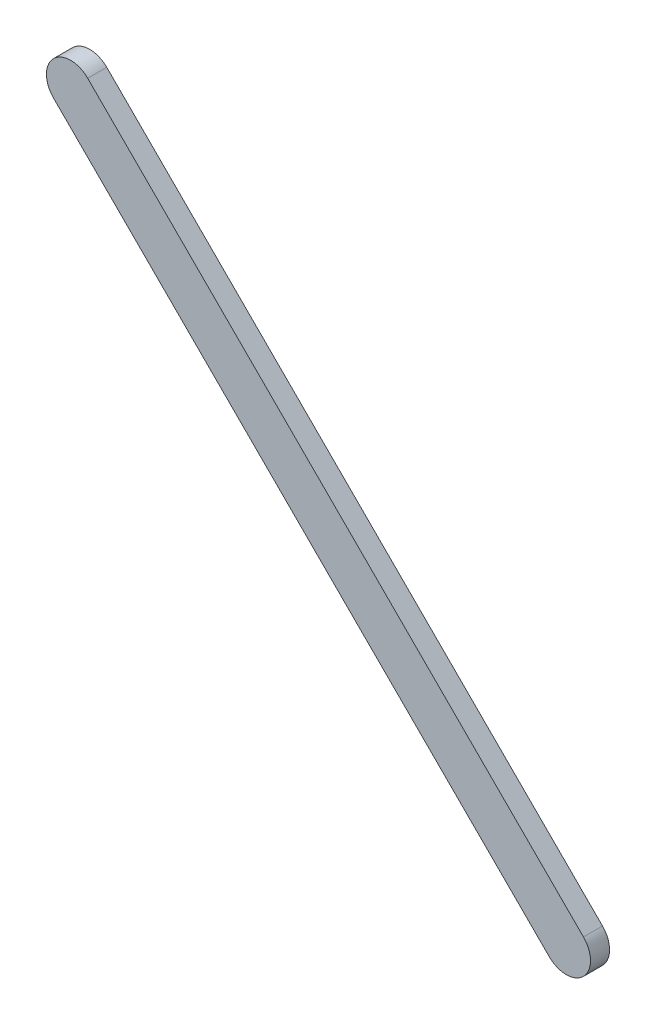
ISO-10303-21;
HEADER;
FILE_DESCRIPTION(('STEP AP214'),'2;1');
FILE_NAME('part.step','',(''),(''),'','','');
FILE_SCHEMA(('AUTOMOTIVE_DESIGN { 1 0 10303 214 1 1 1 1 }'));
ENDSEC;
DATA;
#1=APPLICATION_CONTEXT('core data for automotive mechanical design processes');
#2=APPLICATION_PROTOCOL_DEFINITION('international standard','automotive_design',2000,#1);
#3=PRODUCT_CONTEXT('',#1,'mechanical');
#4=PRODUCT('Part','Part','',(#3));
#5=PRODUCT_RELATED_PRODUCT_CATEGORY('part','',(#4));
#6=PRODUCT_DEFINITION_FORMATION('','',#4);
#7=PRODUCT_DEFINITION_CONTEXT('part definition',#1,'design');
#8=PRODUCT_DEFINITION('design','',#6,#7);
#9=PRODUCT_DEFINITION_SHAPE('','',#8);
#10=(LENGTH_UNIT() NAMED_UNIT(*) SI_UNIT(.MILLI.,.METRE.));
#11=(NAMED_UNIT(*) PLANE_ANGLE_UNIT() SI_UNIT($,.RADIAN.));
#12=(NAMED_UNIT(*) SI_UNIT($,.STERADIAN.) SOLID_ANGLE_UNIT());
#13=UNCERTAINTY_MEASURE_WITH_UNIT(LENGTH_MEASURE(1.E-05),#10,'distance_accuracy_value','');
#14=(GEOMETRIC_REPRESENTATION_CONTEXT(3) GLOBAL_UNCERTAINTY_ASSIGNED_CONTEXT((#13)) GLOBAL_UNIT_ASSIGNED_CONTEXT((#10,
#11,#12)) REPRESENTATION_CONTEXT('',''));
#15=CARTESIAN_POINT('',(0.,0.,0.));
#16=DIRECTION('',(0.,0.,1.));
#17=DIRECTION('',(1.,0.,0.));
#18=AXIS2_PLACEMENT_3D('',#15,#16,#17);
#19=CARTESIAN_POINT('',(105.10339406,116.40639406,0.));
#20=DIRECTION('',(0.707106781186548,0.707106781186548,0.));
#21=DIRECTION('',(0.707106781186548,-0.707106781186548,0.));
#22=AXIS2_PLACEMENT_3D('',#19,#20,#21);
#23=PLANE('',#22);
#24=DIRECTION('',(0.707106781186548,-0.707106781186548,0.));
#25=VECTOR('',#24,1.);
#26=CARTESIAN_POINT('',(105.10339406,116.40639406,0.1999996));
#27=LINE('',#26,#25);
#28=CARTESIAN_POINT('',(105.10339406,116.40639406,0.1999996));
#29=VERTEX_POINT('',#28);
#30=CARTESIAN_POINT('',(110.31039406,111.19939406,0.1999996));
#31=VERTEX_POINT('',#30);
#32=EDGE_CURVE('E11',#29,#31,#27,.T.);
#33=ORIENTED_EDGE('',*,*,#32,.F.);
#34=DIRECTION('',(0.,0.,1.));
#35=VECTOR('',#34,1.);
#36=CARTESIAN_POINT('',(105.10339406,116.40639406,0.));
#37=LINE('',#36,#35);
#38=CARTESIAN_POINT('',(105.10339406,116.40639406,0.));
#39=VERTEX_POINT('',#38);
#40=EDGE_CURVE('E24',#39,#29,#37,.T.);
#41=ORIENTED_EDGE('',*,*,#40,.F.);
#42=DIRECTION('',(0.707106781186548,-0.707106781186548,0.));
#43=VECTOR('',#42,1.);
#44=CARTESIAN_POINT('',(105.10339406,116.40639406,0.));
#45=LINE('',#44,#43);
#46=CARTESIAN_POINT('',(110.31039406,111.19939406,0.));
#47=VERTEX_POINT('',#46);
#48=EDGE_CURVE('E75',#39,#47,#45,.T.);
#49=ORIENTED_EDGE('',*,*,#48,.T.);
#50=DIRECTION('',(0.,0.,1.));
#51=VECTOR('',#50,1.);
#52=CARTESIAN_POINT('',(110.31039406,111.19939406,0.));
#53=LINE('',#52,#51);
#54=EDGE_CURVE('E37',#47,#31,#53,.T.);
#55=ORIENTED_EDGE('',*,*,#54,.T.);
#56=EDGE_LOOP('',(#33,#41,#49,#55));
#57=FACE_BOUND('',#56,.T.);
#58=ADVANCED_FACE('F17',(#57),#23,.F.);
#59=CARTESIAN_POINT('',(110.49,111.379,0.));
#60=DIRECTION('',(0.,0.,-1.));
#61=DIRECTION('',(-0.707106781186548,-0.707106781186548,0.));
#62=AXIS2_PLACEMENT_3D('',#59,#60,#61);
#63=CYLINDRICAL_SURFACE('',#62,0.254001156230778);
#64=CARTESIAN_POINT('',(110.49,111.379,0.1999996));
#65=DIRECTION('',(0.,0.,1.));
#66=DIRECTION('',(-0.707106781186548,-0.707106781186548,0.));
#67=AXIS2_PLACEMENT_3D('',#64,#65,#66);
#68=CIRCLE('',#67,0.254001156230778);
#69=CARTESIAN_POINT('',(110.66960594,111.55860594,0.1999996));
#70=VERTEX_POINT('',#69);
#71=EDGE_CURVE('E83',#31,#70,#68,.T.);
#72=ORIENTED_EDGE('',*,*,#71,.F.);
#73=ORIENTED_EDGE('',*,*,#54,.F.);
#74=CARTESIAN_POINT('',(110.49,111.379,0.));
#75=DIRECTION('',(0.,0.,1.));
#76=DIRECTION('',(-0.707106781186548,-0.707106781186548,0.));
#77=AXIS2_PLACEMENT_3D('',#74,#75,#76);
#78=CIRCLE('',#77,0.254001156230778);
#79=CARTESIAN_POINT('',(110.66960594,111.55860594,0.));
#80=VERTEX_POINT('',#79);
#81=EDGE_CURVE('E81',#47,#80,#78,.T.);
#82=ORIENTED_EDGE('',*,*,#81,.T.);
#83=DIRECTION('',(0.,0.,1.));
#84=VECTOR('',#83,1.);
#85=CARTESIAN_POINT('',(110.66960594,111.55860594,0.));
#86=LINE('',#85,#84);
#87=EDGE_CURVE('E67',#80,#70,#86,.T.);
#88=ORIENTED_EDGE('',*,*,#87,.T.);
#89=EDGE_LOOP('',(#72,#73,#82,#88));
#90=FACE_BOUND('',#89,.T.);
#91=ADVANCED_FACE('F89',(#90),#63,.T.);
#92=CARTESIAN_POINT('',(110.66960594,111.55860594,0.));
#93=DIRECTION('',(-0.707106781186547,-0.707106781186549,0.));
#94=DIRECTION('',(-0.707106781186549,0.707106781186547,0.));
#95=AXIS2_PLACEMENT_3D('',#92,#93,#94);
#96=PLANE('',#95);
#97=DIRECTION('',(-0.707106781186549,0.707106781186547,0.));
#98=VECTOR('',#97,1.);
#99=CARTESIAN_POINT('',(110.66960594,111.55860594,0.1999996));
#100=LINE('',#99,#98);
#101=CARTESIAN_POINT('',(105.46260594,116.76560594,0.1999996));
#102=VERTEX_POINT('',#101);
#103=EDGE_CURVE('E71',#70,#102,#100,.T.);
#104=ORIENTED_EDGE('',*,*,#103,.F.);
#105=ORIENTED_EDGE('',*,*,#87,.F.);
#106=DIRECTION('',(-0.707106781186549,0.707106781186547,0.));
#107=VECTOR('',#106,1.);
#108=CARTESIAN_POINT('',(110.66960594,111.55860594,0.));
#109=LINE('',#108,#107);
#110=CARTESIAN_POINT('',(105.46260594,116.76560594,0.));
#111=VERTEX_POINT('',#110);
#112=EDGE_CURVE('E63',#80,#111,#109,.T.);
#113=ORIENTED_EDGE('',*,*,#112,.T.);
#114=DIRECTION('',(0.,0.,1.));
#115=VECTOR('',#114,1.);
#116=CARTESIAN_POINT('',(105.46260594,116.76560594,0.));
#117=LINE('',#116,#115);
#118=EDGE_CURVE('E53',#111,#102,#117,.T.);
#119=ORIENTED_EDGE('',*,*,#118,.T.);
#120=EDGE_LOOP('',(#104,#105,#113,#119));
#121=FACE_BOUND('',#120,.T.);
#122=ADVANCED_FACE('F66',(#121),#96,.F.);
#123=CARTESIAN_POINT('',(105.283,116.586,0.));
#124=DIRECTION('',(0.,0.,-1.));
#125=DIRECTION('',(0.707106781186548,0.707106781186548,0.));
#126=AXIS2_PLACEMENT_3D('',#123,#124,#125);
#127=CYLINDRICAL_SURFACE('',#126,0.254001156230771);
#128=CARTESIAN_POINT('',(105.283,116.586,0.1999996));
#129=DIRECTION('',(0.,0.,1.));
#130=DIRECTION('',(0.707106781186548,0.707106781186548,0.));
#131=AXIS2_PLACEMENT_3D('',#128,#129,#130);
#132=CIRCLE('',#131,0.254001156230771);
#133=EDGE_CURVE('E59',#102,#29,#132,.T.);
#134=ORIENTED_EDGE('',*,*,#133,.F.);
#135=ORIENTED_EDGE('',*,*,#118,.F.);
#136=CARTESIAN_POINT('',(105.283,116.586,0.));
#137=DIRECTION('',(0.,0.,1.));
#138=DIRECTION('',(0.707106781186548,0.707106781186548,0.));
#139=AXIS2_PLACEMENT_3D('',#136,#137,#138);
#140=CIRCLE('',#139,0.254001156230771);
#141=EDGE_CURVE('E57',#111,#39,#140,.T.);
#142=ORIENTED_EDGE('',*,*,#141,.T.);
#143=ORIENTED_EDGE('',*,*,#40,.T.);
#144=EDGE_LOOP('',(#134,#135,#142,#143));
#145=FACE_BOUND('',#144,.T.);
#146=ADVANCED_FACE('F55',(#145),#127,.T.);
#147=CARTESIAN_POINT('',(105.10339406,116.40639406,0.));
#148=DIRECTION('',(0.,0.,-1.));
#149=DIRECTION('',(-1.,0.,0.));
#150=AXIS2_PLACEMENT_3D('',#147,#148,#149);
#151=PLANE('',#150);
#152=ORIENTED_EDGE('',*,*,#141,.F.);
#153=ORIENTED_EDGE('',*,*,#112,.F.);
#154=ORIENTED_EDGE('',*,*,#81,.F.);
#155=ORIENTED_EDGE('',*,*,#48,.F.);
#156=EDGE_LOOP('',(#152,#153,#154,#155));
#157=FACE_BOUND('',#156,.T.);
#158=ADVANCED_FACE('F74',(#157),#151,.T.);
#159=CARTESIAN_POINT('',(105.10339406,116.40639406,0.1999996));
#160=DIRECTION('',(0.,0.,-1.));
#161=DIRECTION('',(-1.,0.,0.));
#162=AXIS2_PLACEMENT_3D('',#159,#160,#161);
#163=PLANE('',#162);
#164=ORIENTED_EDGE('',*,*,#32,.T.);
#165=ORIENTED_EDGE('',*,*,#71,.T.);
#166=ORIENTED_EDGE('',*,*,#103,.T.);
#167=ORIENTED_EDGE('',*,*,#133,.T.);
#168=EDGE_LOOP('',(#164,#165,#166,#167));
#169=FACE_BOUND('',#168,.T.);
#170=ADVANCED_FACE('F91',(#169),#163,.F.);
#171=CLOSED_SHELL('',(#58,#91,#122,#146,#158,#170));
#172=MANIFOLD_SOLID_BREP('B1',#171);
#173=ADVANCED_BREP_SHAPE_REPRESENTATION('',(#18,#172),#14);
#174=SHAPE_DEFINITION_REPRESENTATION(#9,#173);
ENDSEC;
END-ISO-10303-21;
